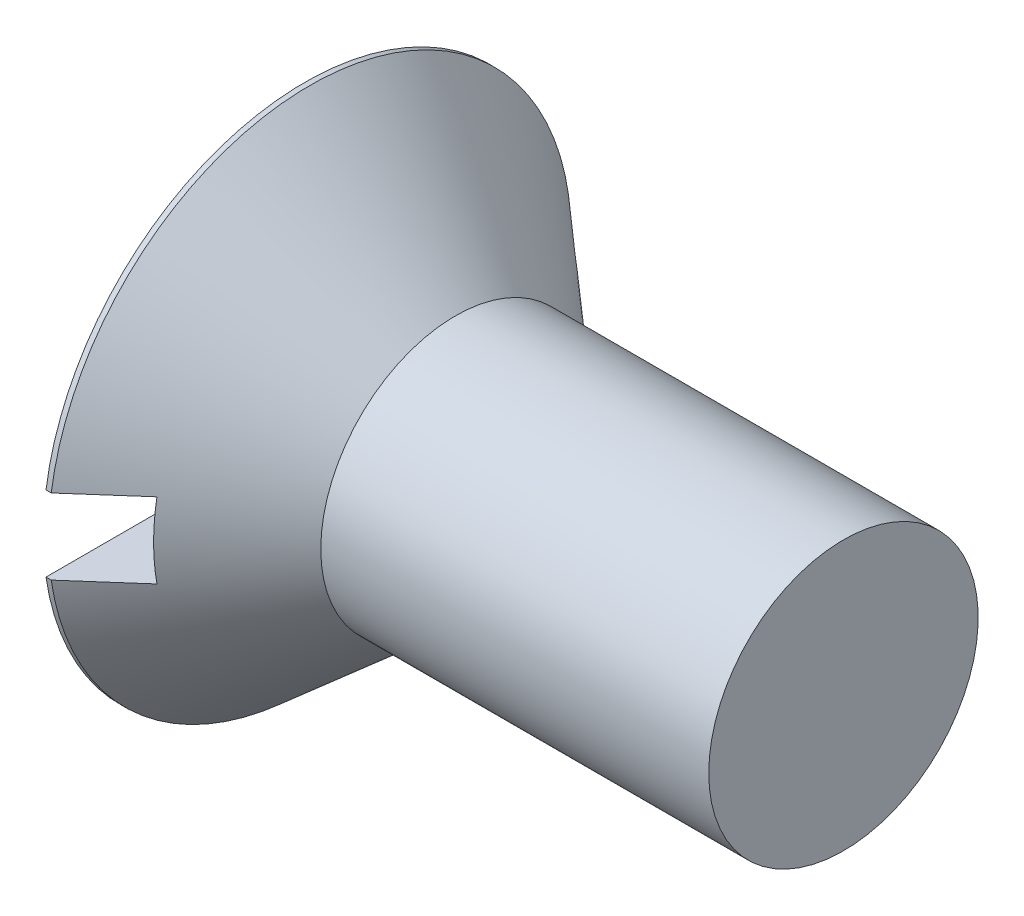
ISO-10303-21;
HEADER;
FILE_DESCRIPTION(('STEP AP214'),'2;1');
FILE_NAME('part.step','',(''),(''),'','','');
FILE_SCHEMA(('AUTOMOTIVE_DESIGN { 1 0 10303 214 1 1 1 1 }'));
ENDSEC;
DATA;
#1=APPLICATION_CONTEXT('core data for automotive mechanical design processes');
#2=APPLICATION_PROTOCOL_DEFINITION('international standard','automotive_design',2000,#1);
#3=PRODUCT_CONTEXT('',#1,'mechanical');
#4=PRODUCT('Part','Part','',(#3));
#5=PRODUCT_RELATED_PRODUCT_CATEGORY('part','',(#4));
#6=PRODUCT_DEFINITION_FORMATION('','',#4);
#7=PRODUCT_DEFINITION_CONTEXT('part definition',#1,'design');
#8=PRODUCT_DEFINITION('design','',#6,#7);
#9=PRODUCT_DEFINITION_SHAPE('','',#8);
#10=(LENGTH_UNIT() NAMED_UNIT(*) SI_UNIT(.MILLI.,.METRE.));
#11=(NAMED_UNIT(*) PLANE_ANGLE_UNIT() SI_UNIT($,.RADIAN.));
#12=(NAMED_UNIT(*) SI_UNIT($,.STERADIAN.) SOLID_ANGLE_UNIT());
#13=UNCERTAINTY_MEASURE_WITH_UNIT(LENGTH_MEASURE(1.E-05),#10,'distance_accuracy_value','');
#14=(GEOMETRIC_REPRESENTATION_CONTEXT(3) GLOBAL_UNCERTAINTY_ASSIGNED_CONTEXT((#13)) GLOBAL_UNIT_ASSIGNED_CONTEXT((#10,
#11,#12)) REPRESENTATION_CONTEXT('',''));
#15=CARTESIAN_POINT('',(0.,0.,0.));
#16=DIRECTION('',(0.,0.,1.));
#17=DIRECTION('',(1.,0.,0.));
#18=AXIS2_PLACEMENT_3D('',#15,#16,#17);
#19=CARTESIAN_POINT('',(0.,0.,0.));
#20=DIRECTION('',(-1.,0.,0.));
#21=DIRECTION('',(0.,0.,1.));
#22=AXIS2_PLACEMENT_3D('',#19,#20,#21);
#23=PLANE('',#22);
#24=DIRECTION('',(0.,0.,-1.));
#25=VECTOR('',#24,1.);
#26=CARTESIAN_POINT('',(0.,0.889000000000001,6.1595));
#27=LINE('',#26,#25);
#28=CARTESIAN_POINT('',(0.,0.889,6.09500773174243));
#29=VERTEX_POINT('',#28);
#30=CARTESIAN_POINT('',(0.,0.888999999999999,-6.09500773174243));
#31=VERTEX_POINT('',#30);
#32=EDGE_CURVE('E144',#29,#31,#27,.T.);
#33=ORIENTED_EDGE('',*,*,#32,.F.);
#34=CARTESIAN_POINT('',(0.,0.,0.));
#35=DIRECTION('',(-1.,0.,0.));
#36=DIRECTION('',(0.,0.,1.));
#37=AXIS2_PLACEMENT_3D('',#34,#35,#36);
#38=CIRCLE('',#37,6.1595);
#39=EDGE_CURVE('E99',#29,#31,#38,.T.);
#40=ORIENTED_EDGE('',*,*,#39,.T.);
#41=EDGE_LOOP('',(#33,#40));
#42=FACE_BOUND('',#41,.T.);
#43=ADVANCED_FACE('F33',(#42),#23,.T.);
#44=CARTESIAN_POINT('',(-6.34999999999999,0.,0.));
#45=DIRECTION('',(-1.,0.,0.));
#46=DIRECTION('',(0.,0.,1.));
#47=AXIS2_PLACEMENT_3D('',#44,#45,#46);
#48=CYLINDRICAL_SURFACE('',#47,6.1595);
#49=DIRECTION('',(-1.,0.,0.));
#50=VECTOR('',#49,1.);
#51=CARTESIAN_POINT('',(-6.34999999999999,0.888999999999999,-6.09500773174243));
#52=LINE('',#51,#50);
#53=CARTESIAN_POINT('',(0.122725488648909,0.888999999999999,-6.09500773174243));
#54=VERTEX_POINT('',#53);
#55=EDGE_CURVE('E61',#31,#54,#52,.F.);
#56=ORIENTED_EDGE('',*,*,#55,.F.);
#57=ORIENTED_EDGE('',*,*,#39,.F.);
#58=DIRECTION('',(-1.,0.,0.));
#59=VECTOR('',#58,1.);
#60=CARTESIAN_POINT('',(-6.34999999999999,0.889,6.09500773174243));
#61=LINE('',#60,#59);
#62=CARTESIAN_POINT('',(0.122725488648909,0.889000000000001,6.09500773174243));
#63=VERTEX_POINT('',#62);
#64=EDGE_CURVE('E147',#63,#29,#61,.T.);
#65=ORIENTED_EDGE('',*,*,#64,.F.);
#66=CARTESIAN_POINT('',(0.122725488648909,0.,0.));
#67=DIRECTION('',(-1.,0.,0.));
#68=DIRECTION('',(0.,0.,1.));
#69=AXIS2_PLACEMENT_3D('',#66,#67,#68);
#70=CIRCLE('',#69,6.1595);
#71=EDGE_CURVE('E110',#63,#54,#70,.T.);
#72=ORIENTED_EDGE('',*,*,#71,.T.);
#73=EDGE_LOOP('',(#56,#57,#65,#72));
#74=FACE_BOUND('',#73,.T.);
#75=ADVANCED_FACE('F146',(#74),#48,.T.);
#76=DIRECTION('',(0.,0.,1.));
#77=VECTOR('',#76,1.);
#78=CARTESIAN_POINT('',(0.,-0.889000000000001,-6.1595));
#79=LINE('',#78,#77);
#80=CARTESIAN_POINT('',(0.,-0.889000000000001,-6.09500773174243));
#81=VERTEX_POINT('',#80);
#82=CARTESIAN_POINT('',(0.,-0.889000000000001,6.09500773174243));
#83=VERTEX_POINT('',#82);
#84=EDGE_CURVE('E104',#81,#83,#79,.T.);
#85=ORIENTED_EDGE('',*,*,#84,.F.);
#86=EDGE_CURVE('E129',#81,#83,#38,.T.);
#87=ORIENTED_EDGE('',*,*,#86,.T.);
#88=EDGE_LOOP('',(#85,#87));
#89=FACE_BOUND('',#88,.T.);
#90=ADVANCED_FACE('F35',(#89),#23,.T.);
#91=DIRECTION('',(-1.,0.,0.));
#92=VECTOR('',#91,1.);
#93=CARTESIAN_POINT('',(-6.34999999999999,-0.889000000000001,6.09500773174243));
#94=LINE('',#93,#92);
#95=CARTESIAN_POINT('',(0.122725488648909,-0.889000000000001,6.09500773174243));
#96=VERTEX_POINT('',#95);
#97=EDGE_CURVE('E130',#83,#96,#94,.F.);
#98=ORIENTED_EDGE('',*,*,#97,.F.);
#99=ORIENTED_EDGE('',*,*,#86,.F.);
#100=DIRECTION('',(-1.,0.,0.));
#101=VECTOR('',#100,1.);
#102=CARTESIAN_POINT('',(-6.34999999999999,-0.889000000000001,-6.09500773174243));
#103=LINE('',#102,#101);
#104=CARTESIAN_POINT('',(0.122725488648909,-0.889000000000001,-6.09500773174243));
#105=VERTEX_POINT('',#104);
#106=EDGE_CURVE('E119',#105,#81,#103,.T.);
#107=ORIENTED_EDGE('',*,*,#106,.F.);
#108=EDGE_CURVE('E127',#105,#96,#70,.T.);
#109=ORIENTED_EDGE('',*,*,#108,.T.);
#110=EDGE_LOOP('',(#98,#99,#107,#109));
#111=FACE_BOUND('',#110,.T.);
#112=ADVANCED_FACE('F126',(#111),#48,.T.);
#113=CARTESIAN_POINT('',(0.122725488648909,0.,0.));
#114=DIRECTION('',(-1.,0.,0.));
#115=DIRECTION('',(0.,0.,1.));
#116=AXIS2_PLACEMENT_3D('',#113,#114,#115);
#117=CONICAL_SURFACE('',#116,6.1595,0.715584993317677);
#118=CARTESIAN_POINT('',(-7.31151043040796,0.888999999999998,-12.5906364427119));
#119=CARTESIAN_POINT('',(-6.81753149837582,0.888999999999999,-12.1601494532226));
#120=CARTESIAN_POINT('',(-6.32359882130326,0.888999999999999,-11.7296093316237));
#121=CARTESIAN_POINT('',(-5.33588058563866,0.888999999999999,-10.8683504567651));
#122=CARTESIAN_POINT('',(-4.8420950285593,0.888999999999999,-10.4376317017707));
#123=CARTESIAN_POINT('',(-3.85449582719149,0.888999999999999,-9.57574261416483));
#124=CARTESIAN_POINT('',(-3.36068228562492,0.888999999999999,-9.14457216383962));
#125=CARTESIAN_POINT('',(-2.37337914273823,0.888999999999999,-8.28186984611948));
#126=CARTESIAN_POINT('',(-1.87988953839065,0.888999999999999,-7.85033798219057));
#127=CARTESIAN_POINT('',(-0.923921841459331,0.888999999999999,-7.0133811402029));
#128=CARTESIAN_POINT('',(-0.461412750749005,0.888999999999999,-6.60799156879519));
#129=CARTESIAN_POINT('',(0.462860911440743,0.888999999999999,-5.79633808094841));
#130=CARTESIAN_POINT('',(0.924625462359873,0.888999999999999,-5.39007414106342));
#131=CARTESIAN_POINT('',(1.61608355843165,0.888999999999999,-4.77949574353229));
#132=CARTESIAN_POINT('',(1.84633089399188,0.888999999999999,-4.57580862119673));
#133=CARTESIAN_POINT('',(2.30627455206156,0.888999999999999,-4.16780827659465));
#134=CARTESIAN_POINT('',(2.53597086960947,0.888999999999999,-3.96349504872793));
#135=CARTESIAN_POINT('',(2.99449008257098,0.888999999999999,-3.55391273214838));
#136=CARTESIAN_POINT('',(3.22331301903337,0.888999999999999,-3.34864368939096));
#137=CARTESIAN_POINT('',(3.67953042426549,0.888999999999999,-2.93652532958522));
#138=CARTESIAN_POINT('',(3.90692492167919,0.889,-2.72967604441046));
#139=CARTESIAN_POINT('',(4.19329825648961,0.889,-2.46569930379462));
#140=CARTESIAN_POINT('',(4.25355456695227,0.889,-2.40995860737033));
#141=CARTESIAN_POINT('',(4.37381836236618,0.889,-2.29820980576881));
#142=CARTESIAN_POINT('',(4.43382584832826,0.889,-2.24220170167991));
#143=CARTESIAN_POINT('',(4.61344578151558,0.889,-2.0736460331092));
#144=CARTESIAN_POINT('',(4.73260439104827,0.889,-1.96061423559287));
#145=CARTESIAN_POINT('',(4.97098757412414,0.889,-1.73065477794563));
#146=CARTESIAN_POINT('',(5.09018012587742,0.889,-1.61369358378843));
#147=CARTESIAN_POINT('',(5.26621363187091,0.889,-1.43563516477463));
#148=CARTESIAN_POINT('',(5.32440463936624,0.889,-1.37587592600762));
#149=CARTESIAN_POINT('',(5.43949854168999,0.889,-1.25513002850696));
#150=CARTESIAN_POINT('',(5.49640152745383,0.889,-1.19414345700196));
#151=CARTESIAN_POINT('',(5.60911898215973,0.889,-1.06956933290217));
#152=CARTESIAN_POINT('',(5.66490623114929,0.889,-1.00595705172487));
#153=CARTESIAN_POINT('',(5.77343589755307,0.889,-0.876198030464183));
#154=CARTESIAN_POINT('',(5.82618025565965,0.889,-0.810052951557791));
#155=CARTESIAN_POINT('',(5.90104078130097,0.889,-0.708472290731803));
#156=CARTESIAN_POINT('',(5.9251163562183,0.889,-0.674487336312746));
#157=CARTESIAN_POINT('',(5.97156459611044,0.889,-0.605379483125493));
#158=CARTESIAN_POINT('',(5.99393789462862,0.889,-0.570257014717792));
#159=CARTESIAN_POINT('',(6.03629856665194,0.889,-0.498787684736802));
#160=CARTESIAN_POINT('',(6.05629562517632,0.889,-0.462446625857953));
#161=CARTESIAN_POINT('',(6.09314504520349,0.889,-0.388220404947528));
#162=CARTESIAN_POINT('',(6.11000134673368,0.889,-0.350337251180223));
#163=CARTESIAN_POINT('',(6.13331105143147,0.889,-0.289077773401494));
#164=CARTESIAN_POINT('',(6.14117153258342,0.889,-0.266238654408465));
#165=CARTESIAN_POINT('',(6.15519452166959,0.889,-0.220041591044936));
#166=CARTESIAN_POINT('',(6.16135666250767,0.889,-0.196683535683558));
#167=CARTESIAN_POINT('',(6.17686637254345,0.889,-0.12606225590315));
#168=CARTESIAN_POINT('',(6.18329926251414,0.889,-0.0780974512717798));
#169=CARTESIAN_POINT('',(6.18703461688254,0.889,0.0184537702274809));
#170=CARTESIAN_POINT('',(6.18428695246186,0.889,0.0670421520895294));
#171=CARTESIAN_POINT('',(6.17014853514273,0.889,0.163003334625176));
#172=CARTESIAN_POINT('',(6.15873564100236,0.889,0.210372699391016));
#173=CARTESIAN_POINT('',(6.13276109809224,0.889,0.291821488178843));
#174=CARTESIAN_POINT('',(6.11960186116897,0.889,0.326373655886872));
#175=CARTESIAN_POINT('',(6.09029458390121,0.889,0.394201582293508));
#176=CARTESIAN_POINT('',(6.07414436337464,0.889,0.427476388401993));
#177=CARTESIAN_POINT('',(6.0395227240665,0.889,0.492952340300211));
#178=CARTESIAN_POINT('',(6.02104200324834,0.889,0.525148489878801));
#179=CARTESIAN_POINT('',(5.98237220869668,0.889,0.588469874983954));
#180=CARTESIAN_POINT('',(5.9621838133122,0.889,0.619595528902379));
#181=CARTESIAN_POINT('',(5.8961176204824,0.889,0.716899551653335));
#182=CARTESIAN_POINT('',(5.8478420054498,0.889,0.78144156901803));
#183=CARTESIAN_POINT('',(5.7477506154296,0.889,0.907740722373645));
#184=CARTESIAN_POINT('',(5.69593140642682,0.889,0.969495057880027));
#185=CARTESIAN_POINT('',(5.5899257882447,0.889,1.09120453286482));
#186=CARTESIAN_POINT('',(5.53573369309567,0.889,1.15115469633921));
#187=CARTESIAN_POINT('',(5.42585006051589,0.889,1.26966673461868));
#188=CARTESIAN_POINT('',(5.37015834853114,0.889,1.32822844630435));
#189=CARTESIAN_POINT('',(5.25748323127301,0.889,1.44458407138188));
#190=CARTESIAN_POINT('',(5.2004952839863,0.889,1.50237357303499));
#191=CARTESIAN_POINT('',(5.08574505757675,0.889,1.61718773091339));
#192=CARTESIAN_POINT('',(5.02798270311785,0.889,1.67421231162998));
#193=CARTESIAN_POINT('',(4.9119857410796,0.889,1.78756823242782));
#194=CARTESIAN_POINT('',(4.85375217056311,0.889,1.84390063548012));
#195=CARTESIAN_POINT('',(4.73684362990091,0.889,1.9561006028999));
#196=CARTESIAN_POINT('',(4.67816867590618,0.889,2.01196818411997));
#197=CARTESIAN_POINT('',(4.50311103016756,0.889,2.1776183243649));
#198=CARTESIAN_POINT('',(4.38622788622288,0.889,2.28687175946658));
#199=CARTESIAN_POINT('',(4.15158118000607,0.889,2.50442984627599));
#200=CARTESIAN_POINT('',(4.03381760307984,0.889,2.61273448212628));
#201=CARTESIAN_POINT('',(3.67961455063303,0.889,2.9366773007784));
#202=CARTESIAN_POINT('',(3.44227622380513,0.889,3.15133179763573));
#203=CARTESIAN_POINT('',(2.96614674295652,0.889,3.57939864014281));
#204=CARTESIAN_POINT('',(2.727354586147,0.889,3.7928098658596));
#205=CARTESIAN_POINT('',(2.24900142557747,0.889,4.21875332816209));
#206=CARTESIAN_POINT('',(2.0094404466197,0.889,4.43128559260683));
#207=CARTESIAN_POINT('',(1.53101504935621,0.889,4.8547252689842));
#208=CARTESIAN_POINT('',(1.29215312073127,0.889,5.06563549673143));
#209=CARTESIAN_POINT('',(0.814085143200141,0.889,5.48706951585087));
#210=CARTESIAN_POINT('',(0.574879091440782,0.889000000000001,5.69759330398575));
#211=CARTESIAN_POINT('',(-0.142972947800626,0.889000000000001,6.32864353515917));
#212=CARTESIAN_POINT('',(-0.621978998138219,0.889000000000001,6.74876027829013));
#213=CARTESIAN_POINT('',(-1.61675615738177,0.889000000000001,7.62012341013692));
#214=CARTESIAN_POINT('',(-2.13256902407311,0.889000000000001,8.07132209196453));
#215=CARTESIAN_POINT('',(-3.16461476754477,0.889000000000001,8.97333236585136));
#216=CARTESIAN_POINT('',(-3.68084767788648,0.889000000000001,9.42414391950568));
#217=CARTESIAN_POINT('',(-4.71608092027282,0.889000000000001,10.3276984494218));
#218=CARTESIAN_POINT('',(-5.23508242880058,0.889000000000001,10.7804400774647));
#219=CARTESIAN_POINT('',(-6.27320939596535,0.889000000000001,11.6856858053579));
#220=CARTESIAN_POINT('',(-6.7923348390183,0.889000000000001,12.1381899230789));
#221=CARTESIAN_POINT('',(-7.31151043040796,0.889000000000001,12.5906364427119));
#222=B_SPLINE_CURVE_WITH_KNOTS('',3,(#118,#119,#120,#121,#122,#123,#124,#125,#126,#127,#128,
#129,#130,#131,#132,#133,#134,#135,#136,#137,#138,#139,#140,#141,#142,#143,#144,#145,#146,#147,
#148,#149,#150,#151,#152,#153,#154,#155,#156,#157,#158,#159,#160,#161,#162,#163,#164,#165,#166,
#167,#168,#169,#170,#171,#172,#173,#174,#175,#176,#177,#178,#179,#180,#181,#182,#183,#184,#185,
#186,#187,#188,#189,#190,#191,#192,#193,#194,#195,#196,#197,#198,#199,#200,#201,#202,#203,#204,
#205,#206,#207,#208,#209,#210,#211,#212,#213,#214,#215,#216,#217,#218,#219,#220,#221),
.UNSPECIFIED.,.F.,.F.,(4,2,2,2,2,2,2,2,2,2,2,2,2,2,2,2,2,2,2,2,2,2,2,2,2,2,2,2,2,2,2,2,2,2,2,2,
2,2,2,2,2,2,2,2,2,2,2,2,2,2,2,4),(0.,1.96570809414416,3.93143574634148,5.89811761953582,
7.8647808430566,9.70985457797865,11.5549784202422,12.4772145208841,13.3994588946785,
14.3216593757832,15.2438413049248,15.4900938281767,15.7363453500502,16.2290573866282,
16.7299840117202,16.9802042722764,17.2304068116184,17.4841889117495,17.7378073237163,
17.8627170460643,17.9875800504981,18.1119152891498,18.2360934854135,18.3084959927582,
18.3809141376476,18.5252565925599,18.6703884895139,18.8158924781866,18.9266558009301,
19.0375001811282,19.1488018906457,19.2600595929544,19.501606849194,19.7433915944927,
19.9857913462817,20.2282194361941,20.4716951861849,20.7151947964322,20.9582561584974,
21.2013086693769,21.6812804205511,22.1612601783296,23.1212750184917,24.0820511029793,
25.0427964982522,25.9987475323914,26.954706538646,28.8661195313931,30.9220347365566,
32.9781345881674,35.0442995668648,37.1102764607775),.UNSPECIFIED.);
#223=CARTESIAN_POINT('',(1.4478,0.888999999999999,-4.92808687302994));
#224=VERTEX_POINT('',#223);
#225=EDGE_CURVE('E11',#54,#224,#222,.T.);
#226=ORIENTED_EDGE('',*,*,#225,.F.);
#227=ORIENTED_EDGE('',*,*,#71,.F.);
#228=CARTESIAN_POINT('',(1.4478,0.889,4.92808687302994));
#229=VERTEX_POINT('',#228);
#230=EDGE_CURVE('E37',#229,#63,#222,.T.);
#231=ORIENTED_EDGE('',*,*,#230,.F.);
#232=CARTESIAN_POINT('',(1.4478,0.,0.));
#233=DIRECTION('',(-1.,0.,0.));
#234=DIRECTION('',(0.,0.,1.));
#235=AXIS2_PLACEMENT_3D('',#232,#233,#234);
#236=CIRCLE('',#235,5.00763030066418);
#237=CARTESIAN_POINT('',(1.4478,-0.889000000000001,4.92808687302994));
#238=VERTEX_POINT('',#237);
#239=EDGE_CURVE('E90',#229,#238,#236,.F.);
#240=ORIENTED_EDGE('',*,*,#239,.T.);
#241=CARTESIAN_POINT('',(-7.31151043040796,-0.889000000000001,12.5906364427119));
#242=CARTESIAN_POINT('',(-6.81753149837582,-0.889000000000001,12.1601494532226));
#243=CARTESIAN_POINT('',(-6.32359882130326,-0.889000000000001,11.7296093316237));
#244=CARTESIAN_POINT('',(-5.33588058563866,-0.889000000000001,10.8683504567651));
#245=CARTESIAN_POINT('',(-4.8420950285593,-0.889000000000001,10.4376317017707));
#246=CARTESIAN_POINT('',(-3.85449582719149,-0.889000000000001,9.57574261416483));
#247=CARTESIAN_POINT('',(-3.36068228562492,-0.889000000000001,9.14457216383962));
#248=CARTESIAN_POINT('',(-2.37337914273823,-0.889000000000001,8.28186984611948));
#249=CARTESIAN_POINT('',(-1.87988953839065,-0.889000000000001,7.85033798219057));
#250=CARTESIAN_POINT('',(-0.923921841459332,-0.889000000000001,7.0133811402029));
#251=CARTESIAN_POINT('',(-0.461412750749005,-0.889000000000001,6.60799156879519));
#252=CARTESIAN_POINT('',(0.462860911440743,-0.889000000000001,5.79633808094841));
#253=CARTESIAN_POINT('',(0.924625462359873,-0.889000000000001,5.39007414106342));
#254=CARTESIAN_POINT('',(1.61608355843165,-0.889000000000001,4.77949574353229));
#255=CARTESIAN_POINT('',(1.84633089399188,-0.889000000000001,4.57580862119673));
#256=CARTESIAN_POINT('',(2.30627455206156,-0.889000000000001,4.16780827659464));
#257=CARTESIAN_POINT('',(2.53597086960947,-0.889000000000001,3.96349504872793));
#258=CARTESIAN_POINT('',(2.99449008257098,-0.889000000000001,3.55391273214838));
#259=CARTESIAN_POINT('',(3.22331301903337,-0.889000000000001,3.34864368939095));
#260=CARTESIAN_POINT('',(3.67953042426549,-0.889000000000001,2.93652532958522));
#261=CARTESIAN_POINT('',(3.90692492167919,-0.889000000000001,2.72967604441046));
#262=CARTESIAN_POINT('',(4.19329825648961,-0.889000000000001,2.46569930379461));
#263=CARTESIAN_POINT('',(4.25355456695228,-0.889000000000001,2.40995860737033));
#264=CARTESIAN_POINT('',(4.37381836236618,-0.889000000000001,2.2982098057688));
#265=CARTESIAN_POINT('',(4.43382584832826,-0.889000000000001,2.2422017016799));
#266=CARTESIAN_POINT('',(4.61344578151559,-0.889000000000001,2.0736460331092));
#267=CARTESIAN_POINT('',(4.73260439104827,-0.889000000000001,1.96061423559287));
#268=CARTESIAN_POINT('',(4.97098757412414,-0.889000000000001,1.73065477794563));
#269=CARTESIAN_POINT('',(5.09018012587742,-0.889000000000001,1.61369358378843));
#270=CARTESIAN_POINT('',(5.26621363187091,-0.889000000000001,1.43563516477463));
#271=CARTESIAN_POINT('',(5.32440463936624,-0.889000000000001,1.37587592600762));
#272=CARTESIAN_POINT('',(5.43949854168999,-0.889000000000001,1.25513002850696));
#273=CARTESIAN_POINT('',(5.49640152745383,-0.889000000000001,1.19414345700195));
#274=CARTESIAN_POINT('',(5.60911898215973,-0.889000000000001,1.06956933290217));
#275=CARTESIAN_POINT('',(5.66490623114929,-0.889000000000001,1.00595705172487));
#276=CARTESIAN_POINT('',(5.77343589755307,-0.889000000000001,0.876198030464184));
#277=CARTESIAN_POINT('',(5.82618025565965,-0.889000000000001,0.81005295155779));
#278=CARTESIAN_POINT('',(5.90104078130097,-0.889000000000001,0.708472290731803));
#279=CARTESIAN_POINT('',(5.9251163562183,-0.889000000000001,0.674487336312745));
#280=CARTESIAN_POINT('',(5.97156459611044,-0.889000000000001,0.605379483125491));
#281=CARTESIAN_POINT('',(5.99393789462862,-0.889000000000001,0.570257014717789));
#282=CARTESIAN_POINT('',(6.03629856665194,-0.889000000000001,0.498787684736799));
#283=CARTESIAN_POINT('',(6.05629562517632,-0.889000000000001,0.462446625857951));
#284=CARTESIAN_POINT('',(6.09314504520349,-0.889000000000001,0.388220404947526));
#285=CARTESIAN_POINT('',(6.11000134673368,-0.889000000000001,0.350337251180221));
#286=CARTESIAN_POINT('',(6.13331105143147,-0.889000000000001,0.289077773401493));
#287=CARTESIAN_POINT('',(6.14117153258342,-0.889000000000001,0.266238654408465));
#288=CARTESIAN_POINT('',(6.15519452166959,-0.889000000000001,0.220041591044936));
#289=CARTESIAN_POINT('',(6.16135666250767,-0.889000000000001,0.196683535683557));
#290=CARTESIAN_POINT('',(6.17686637254345,-0.889000000000001,0.126062255903147));
#291=CARTESIAN_POINT('',(6.18329926251414,-0.889000000000001,0.0780974512717774));
#292=CARTESIAN_POINT('',(6.18703461688254,-0.889000000000001,-0.018453770227483));
#293=CARTESIAN_POINT('',(6.18428695246186,-0.889000000000001,-0.0670421520895315));
#294=CARTESIAN_POINT('',(6.17014853514273,-0.889000000000001,-0.163003334625178));
#295=CARTESIAN_POINT('',(6.15873564100235,-0.889000000000001,-0.210372699391018));
#296=CARTESIAN_POINT('',(6.13276109809223,-0.889000000000001,-0.291821488178846));
#297=CARTESIAN_POINT('',(6.11960186116896,-0.889000000000001,-0.326373655886877));
#298=CARTESIAN_POINT('',(6.09029458390121,-0.889000000000001,-0.394201582293513));
#299=CARTESIAN_POINT('',(6.07414436337463,-0.889000000000001,-0.427476388401997));
#300=CARTESIAN_POINT('',(6.0395227240665,-0.889000000000001,-0.492952340300214));
#301=CARTESIAN_POINT('',(6.02104200324834,-0.889000000000001,-0.525148489878804));
#302=CARTESIAN_POINT('',(5.98237220869668,-0.889000000000001,-0.588469874983956));
#303=CARTESIAN_POINT('',(5.9621838133122,-0.889000000000001,-0.619595528902382));
#304=CARTESIAN_POINT('',(5.8961176204824,-0.889000000000001,-0.716899551653339));
#305=CARTESIAN_POINT('',(5.8478420054498,-0.889000000000001,-0.781441569018034));
#306=CARTESIAN_POINT('',(5.7477506154296,-0.889000000000001,-0.907740722373649));
#307=CARTESIAN_POINT('',(5.69593140642682,-0.889000000000001,-0.96949505788003));
#308=CARTESIAN_POINT('',(5.58992578824469,-0.889000000000001,-1.09120453286483));
#309=CARTESIAN_POINT('',(5.53573369309567,-0.889000000000001,-1.15115469633921));
#310=CARTESIAN_POINT('',(5.42585006051589,-0.889000000000001,-1.26966673461868));
#311=CARTESIAN_POINT('',(5.37015834853113,-0.889000000000001,-1.32822844630435));
#312=CARTESIAN_POINT('',(5.257483231273,-0.889000000000001,-1.44458407138189));
#313=CARTESIAN_POINT('',(5.20049528398629,-0.889000000000001,-1.502373573035));
#314=CARTESIAN_POINT('',(5.08574505757674,-0.889000000000001,-1.61718773091339));
#315=CARTESIAN_POINT('',(5.02798270311784,-0.889000000000001,-1.67421231162999));
#316=CARTESIAN_POINT('',(4.91198574107959,-0.889000000000001,-1.78756823242783));
#317=CARTESIAN_POINT('',(4.8537521705631,-0.889000000000001,-1.84390063548013));
#318=CARTESIAN_POINT('',(4.73684362990089,-0.889000000000001,-1.95610060289991));
#319=CARTESIAN_POINT('',(4.67816867590616,-0.889000000000001,-2.01196818411999));
#320=CARTESIAN_POINT('',(4.50311103016754,-0.889000000000001,-2.17761832436491));
#321=CARTESIAN_POINT('',(4.38622788622287,-0.889000000000001,-2.28687175946659));
#322=CARTESIAN_POINT('',(4.15158118000605,-0.889000000000001,-2.50442984627601));
#323=CARTESIAN_POINT('',(4.03381760307982,-0.889000000000001,-2.6127344821263));
#324=CARTESIAN_POINT('',(3.679614550633,-0.889000000000001,-2.93667730077842));
#325=CARTESIAN_POINT('',(3.44227622380511,-0.889000000000001,-3.15133179763575));
#326=CARTESIAN_POINT('',(2.96614674295649,-0.889000000000001,-3.57939864014284));
#327=CARTESIAN_POINT('',(2.72735458614696,-0.889000000000001,-3.79280986585963));
#328=CARTESIAN_POINT('',(2.24900142557744,-0.889000000000001,-4.21875332816212));
#329=CARTESIAN_POINT('',(2.00944044661966,-0.889000000000001,-4.43128559260686));
#330=CARTESIAN_POINT('',(1.53101504935618,-0.889000000000001,-4.85472526898423));
#331=CARTESIAN_POINT('',(1.29215312073123,-0.889000000000001,-5.06563549673146));
#332=CARTESIAN_POINT('',(0.814085143200097,-0.889000000000001,-5.48706951585091));
#333=CARTESIAN_POINT('',(0.574879091440735,-0.889000000000001,-5.69759330398579));
#334=CARTESIAN_POINT('',(-0.14297294780068,-0.889000000000001,-6.32864353515921));
#335=CARTESIAN_POINT('',(-0.621978998138278,-0.889000000000001,-6.74876027829019));
#336=CARTESIAN_POINT('',(-1.61675615738183,-0.889000000000001,-7.62012341013697));
#337=CARTESIAN_POINT('',(-2.13256902407316,-0.889000000000001,-8.07132209196457));
#338=CARTESIAN_POINT('',(-3.16461476754481,-0.889000000000001,-8.9733323658514));
#339=CARTESIAN_POINT('',(-3.68084767788651,-0.889000000000001,-9.42414391950572));
#340=CARTESIAN_POINT('',(-4.71608092027284,-0.889000000000001,-10.3276984494219));
#341=CARTESIAN_POINT('',(-5.2350824288006,-0.889000000000001,-10.7804400774647));
#342=CARTESIAN_POINT('',(-6.27320939596536,-0.889000000000001,-11.6856858053579));
#343=CARTESIAN_POINT('',(-6.79233483901831,-0.889000000000001,-12.1381899230789));
#344=CARTESIAN_POINT('',(-7.31151043040796,-0.889000000000001,-12.5906364427119));
#345=B_SPLINE_CURVE_WITH_KNOTS('',3,(#241,#242,#243,#244,#245,#246,#247,#248,#249,#250,#251,
#252,#253,#254,#255,#256,#257,#258,#259,#260,#261,#262,#263,#264,#265,#266,#267,#268,#269,#270,
#271,#272,#273,#274,#275,#276,#277,#278,#279,#280,#281,#282,#283,#284,#285,#286,#287,#288,#289,
#290,#291,#292,#293,#294,#295,#296,#297,#298,#299,#300,#301,#302,#303,#304,#305,#306,#307,#308,
#309,#310,#311,#312,#313,#314,#315,#316,#317,#318,#319,#320,#321,#322,#323,#324,#325,#326,#327,
#328,#329,#330,#331,#332,#333,#334,#335,#336,#337,#338,#339,#340,#341,#342,#343,#344),
.UNSPECIFIED.,.F.,.F.,(4,2,2,2,2,2,2,2,2,2,2,2,2,2,2,2,2,2,2,2,2,2,2,2,2,2,2,2,2,2,2,2,2,2,2,2,
2,2,2,2,2,2,2,2,2,2,2,2,2,2,2,4),(0.,1.96570809414416,3.93143574634148,5.89811761953581,
7.8647808430566,9.70985457797864,11.5549784202422,12.4772145208841,13.3994588946785,
14.3216593757832,15.2438413049248,15.4900938281767,15.7363453500502,16.2290573866282,
16.7299840117202,16.9802042722764,17.2304068116184,17.4841889117495,17.7378073237163,
17.8627170460643,17.9875800504981,18.1119152891498,18.2360934854135,18.3084959927582,
18.3809141376476,18.5252565925599,18.6703884895139,18.8158924781866,18.9266558009301,
19.0375001811282,19.1488018906457,19.2600595929544,19.501606849194,19.7433915944927,
19.9857913462817,20.2282194361941,20.4716951861849,20.7151947964323,20.9582561584974,
21.201308669377,21.6812804205511,22.1612601783296,23.1212750184918,24.0820511029794,
25.0427964982523,25.9987475323914,26.9547065386461,28.8661195313932,30.9220347365567,
32.9781345881674,35.0442995668648,37.1102764607775),.UNSPECIFIED.);
#346=EDGE_CURVE('E98',#96,#238,#345,.T.);
#347=ORIENTED_EDGE('',*,*,#346,.F.);
#348=ORIENTED_EDGE('',*,*,#108,.F.);
#349=CARTESIAN_POINT('',(1.4478,-0.889000000000001,-4.92808687302994));
#350=VERTEX_POINT('',#349);
#351=EDGE_CURVE('E47',#350,#105,#345,.T.);
#352=ORIENTED_EDGE('',*,*,#351,.F.);
#353=EDGE_CURVE('E101',#350,#224,#236,.F.);
#354=ORIENTED_EDGE('',*,*,#353,.T.);
#355=EDGE_LOOP('',(#226,#227,#231,#240,#347,#348,#352,#354));
#356=FACE_BOUND('',#355,.T.);
#357=CARTESIAN_POINT('',(3.556,0.,0.));
#358=DIRECTION('',(-1.,0.,0.));
#359=DIRECTION('',(0.,0.,1.));
#360=AXIS2_PLACEMENT_3D('',#357,#358,#359);
#361=CIRCLE('',#360,3.175);
#362=CARTESIAN_POINT('',(3.556,0.,3.175));
#363=VERTEX_POINT('',#362);
#364=EDGE_CURVE('E132',#363,#363,#361,.T.);
#365=ORIENTED_EDGE('',*,*,#364,.T.);
#366=EDGE_LOOP('',(#365));
#367=FACE_BOUND('',#366,.T.);
#368=ADVANCED_FACE('F107',(#356,#367),#117,.T.);
#369=CARTESIAN_POINT('',(-6.34999999999999,0.,0.));
#370=DIRECTION('',(-1.,0.,0.));
#371=DIRECTION('',(0.,0.,1.));
#372=AXIS2_PLACEMENT_3D('',#369,#370,#371);
#373=CYLINDRICAL_SURFACE('',#372,3.175);
#374=CARTESIAN_POINT('',(12.7,0.,0.));
#375=DIRECTION('',(-1.,0.,0.));
#376=DIRECTION('',(0.,0.,1.));
#377=AXIS2_PLACEMENT_3D('',#374,#375,#376);
#378=CIRCLE('',#377,3.175);
#379=CARTESIAN_POINT('',(12.7,0.,3.175));
#380=VERTEX_POINT('',#379);
#381=EDGE_CURVE('E135',#380,#380,#378,.T.);
#382=ORIENTED_EDGE('',*,*,#381,.T.);
#383=EDGE_LOOP('',(#382));
#384=FACE_BOUND('',#383,.T.);
#385=ORIENTED_EDGE('',*,*,#364,.F.);
#386=EDGE_LOOP('',(#385));
#387=FACE_BOUND('',#386,.T.);
#388=ADVANCED_FACE('F188',(#384,#387),#373,.T.);
#389=CARTESIAN_POINT('',(12.7,3.175,0.));
#390=DIRECTION('',(1.,0.,0.));
#391=DIRECTION('',(0.,0.,-1.));
#392=AXIS2_PLACEMENT_3D('',#389,#390,#391);
#393=PLANE('',#392);
#394=ORIENTED_EDGE('',*,*,#381,.F.);
#395=EDGE_LOOP('',(#394));
#396=FACE_BOUND('',#395,.T.);
#397=ADVANCED_FACE('F198',(#396),#393,.T.);
#398=CARTESIAN_POINT('',(1.4478,0.889000000000001,6.1595));
#399=DIRECTION('',(0.,1.,0.));
#400=DIRECTION('',(0.,0.,1.));
#401=AXIS2_PLACEMENT_3D('',#398,#399,#400);
#402=PLANE('',#401);
#403=ORIENTED_EDGE('',*,*,#55,.T.);
#404=ORIENTED_EDGE('',*,*,#225,.T.);
#405=DIRECTION('',(0.,0.,-1.));
#406=VECTOR('',#405,1.);
#407=CARTESIAN_POINT('',(1.4478,0.889000000000001,6.1595));
#408=LINE('',#407,#406);
#409=EDGE_CURVE('E93',#229,#224,#408,.T.);
#410=ORIENTED_EDGE('',*,*,#409,.F.);
#411=ORIENTED_EDGE('',*,*,#230,.T.);
#412=ORIENTED_EDGE('',*,*,#64,.T.);
#413=ORIENTED_EDGE('',*,*,#32,.T.);
#414=EDGE_LOOP('',(#403,#404,#410,#411,#412,#413));
#415=FACE_BOUND('',#414,.T.);
#416=ADVANCED_FACE('F102',(#415),#402,.F.);
#417=CARTESIAN_POINT('',(1.4478,-0.889000000000001,-6.1595));
#418=DIRECTION('',(0.,-1.,0.));
#419=DIRECTION('',(0.,0.,-1.));
#420=AXIS2_PLACEMENT_3D('',#417,#418,#419);
#421=PLANE('',#420);
#422=ORIENTED_EDGE('',*,*,#97,.T.);
#423=ORIENTED_EDGE('',*,*,#346,.T.);
#424=DIRECTION('',(0.,0.,1.));
#425=VECTOR('',#424,1.);
#426=CARTESIAN_POINT('',(1.4478,-0.889000000000001,-6.1595));
#427=LINE('',#426,#425);
#428=EDGE_CURVE('E54',#350,#238,#427,.T.);
#429=ORIENTED_EDGE('',*,*,#428,.F.);
#430=ORIENTED_EDGE('',*,*,#351,.T.);
#431=ORIENTED_EDGE('',*,*,#106,.T.);
#432=ORIENTED_EDGE('',*,*,#84,.T.);
#433=EDGE_LOOP('',(#422,#423,#429,#430,#431,#432));
#434=FACE_BOUND('',#433,.T.);
#435=ADVANCED_FACE('F118',(#434),#421,.F.);
#436=CARTESIAN_POINT('',(1.4478,0.888999999999999,-6.1595));
#437=DIRECTION('',(-1.,0.,0.));
#438=DIRECTION('',(0.,0.,1.));
#439=AXIS2_PLACEMENT_3D('',#436,#437,#438);
#440=PLANE('',#439);
#441=ORIENTED_EDGE('',*,*,#428,.T.);
#442=ORIENTED_EDGE('',*,*,#239,.F.);
#443=ORIENTED_EDGE('',*,*,#409,.T.);
#444=ORIENTED_EDGE('',*,*,#353,.F.);
#445=EDGE_LOOP('',(#441,#442,#443,#444));
#446=FACE_BOUND('',#445,.T.);
#447=ADVANCED_FACE('F92',(#446),#440,.T.);
#448=CLOSED_SHELL('',(#43,#75,#90,#112,#368,#388,#397,#416,#435,#447));
#449=MANIFOLD_SOLID_BREP('B2',#448);
#450=ADVANCED_BREP_SHAPE_REPRESENTATION('',(#18,#449),#14);
#451=SHAPE_DEFINITION_REPRESENTATION(#9,#450);
ENDSEC;
END-ISO-10303-21;
